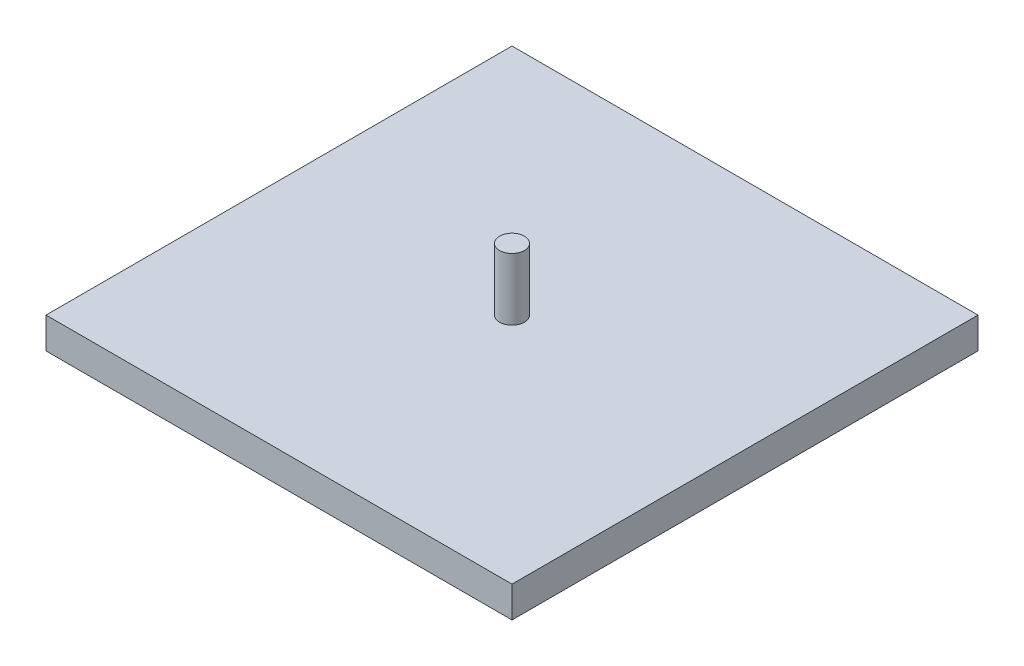
ISO-10303-21;
HEADER;
FILE_DESCRIPTION(('STEP AP214'),'2;1');
FILE_NAME('part.step','',(''),(''),'','','');
FILE_SCHEMA(('AUTOMOTIVE_DESIGN { 1 0 10303 214 1 1 1 1 }'));
ENDSEC;
DATA;
#1=APPLICATION_CONTEXT('core data for automotive mechanical design processes');
#2=APPLICATION_PROTOCOL_DEFINITION('international standard','automotive_design',2000,#1);
#3=PRODUCT_CONTEXT('',#1,'mechanical');
#4=PRODUCT('Part','Part','',(#3));
#5=PRODUCT_RELATED_PRODUCT_CATEGORY('part','',(#4));
#6=PRODUCT_DEFINITION_FORMATION('','',#4);
#7=PRODUCT_DEFINITION_CONTEXT('part definition',#1,'design');
#8=PRODUCT_DEFINITION('design','',#6,#7);
#9=PRODUCT_DEFINITION_SHAPE('','',#8);
#10=(LENGTH_UNIT() NAMED_UNIT(*) SI_UNIT(.MILLI.,.METRE.));
#11=(NAMED_UNIT(*) PLANE_ANGLE_UNIT() SI_UNIT($,.RADIAN.));
#12=(NAMED_UNIT(*) SI_UNIT($,.STERADIAN.) SOLID_ANGLE_UNIT());
#13=UNCERTAINTY_MEASURE_WITH_UNIT(LENGTH_MEASURE(1.E-05),#10,'distance_accuracy_value','');
#14=(GEOMETRIC_REPRESENTATION_CONTEXT(3) GLOBAL_UNCERTAINTY_ASSIGNED_CONTEXT((#13)) GLOBAL_UNIT_ASSIGNED_CONTEXT((#10,
#11,#12)) REPRESENTATION_CONTEXT('',''));
#15=CARTESIAN_POINT('',(0.,0.,0.));
#16=DIRECTION('',(0.,0.,1.));
#17=DIRECTION('',(1.,0.,0.));
#18=AXIS2_PLACEMENT_3D('',#15,#16,#17);
#19=CARTESIAN_POINT('',(-36.9816161073826,10.,-28.5962496644295));
#20=DIRECTION('',(1.,0.,0.));
#21=DIRECTION('',(0.,0.,-1.));
#22=AXIS2_PLACEMENT_3D('',#19,#20,#21);
#23=PLANE('',#22);
#24=DIRECTION('',(0.,0.,1.));
#25=VECTOR('',#24,1.);
#26=CARTESIAN_POINT('',(-36.9816161073826,0.,-28.5962496644295));
#27=LINE('',#26,#25);
#28=CARTESIAN_POINT('',(-36.9816161073826,0.,-28.5962496644295));
#29=VERTEX_POINT('',#28);
#30=CARTESIAN_POINT('',(-36.9816161073825,0.,121.40375033557));
#31=VERTEX_POINT('',#30);
#32=EDGE_CURVE('E96',#29,#31,#27,.T.);
#33=ORIENTED_EDGE('',*,*,#32,.T.);
#34=DIRECTION('',(0.,-1.,0.));
#35=VECTOR('',#34,1.);
#36=CARTESIAN_POINT('',(-36.9816161073825,10.,121.40375033557));
#37=LINE('',#36,#35);
#38=CARTESIAN_POINT('',(-36.9816161073825,10.,121.40375033557));
#39=VERTEX_POINT('',#38);
#40=EDGE_CURVE('E11',#39,#31,#37,.T.);
#41=ORIENTED_EDGE('',*,*,#40,.F.);
#42=DIRECTION('',(0.,0.,1.));
#43=VECTOR('',#42,1.);
#44=CARTESIAN_POINT('',(-36.9816161073826,10.,-28.5962496644295));
#45=LINE('',#44,#43);
#46=CARTESIAN_POINT('',(-36.9816161073826,10.,-28.5962496644295));
#47=VERTEX_POINT('',#46);
#48=EDGE_CURVE('E84',#47,#39,#45,.T.);
#49=ORIENTED_EDGE('',*,*,#48,.F.);
#50=DIRECTION('',(0.,-1.,0.));
#51=VECTOR('',#50,1.);
#52=CARTESIAN_POINT('',(-36.9816161073826,10.,-28.5962496644295));
#53=LINE('',#52,#51);
#54=EDGE_CURVE('E92',#47,#29,#53,.T.);
#55=ORIENTED_EDGE('',*,*,#54,.T.);
#56=EDGE_LOOP('',(#33,#41,#49,#55));
#57=FACE_BOUND('',#56,.T.);
#58=ADVANCED_FACE('F33',(#57),#23,.F.);
#59=CARTESIAN_POINT('',(-36.9816161073825,10.,121.40375033557));
#60=DIRECTION('',(0.,0.,-1.));
#61=DIRECTION('',(-1.,0.,0.));
#62=AXIS2_PLACEMENT_3D('',#59,#60,#61);
#63=PLANE('',#62);
#64=DIRECTION('',(1.,0.,0.));
#65=VECTOR('',#64,1.);
#66=CARTESIAN_POINT('',(-36.9816161073825,0.,121.40375033557));
#67=LINE('',#66,#65);
#68=CARTESIAN_POINT('',(113.018383892617,0.,121.40375033557));
#69=VERTEX_POINT('',#68);
#70=EDGE_CURVE('E88',#31,#69,#67,.T.);
#71=ORIENTED_EDGE('',*,*,#70,.T.);
#72=DIRECTION('',(0.,-1.,0.));
#73=VECTOR('',#72,1.);
#74=CARTESIAN_POINT('',(113.018383892617,10.,121.40375033557));
#75=LINE('',#74,#73);
#76=CARTESIAN_POINT('',(113.018383892617,10.,121.40375033557));
#77=VERTEX_POINT('',#76);
#78=EDGE_CURVE('E41',#77,#69,#75,.T.);
#79=ORIENTED_EDGE('',*,*,#78,.F.);
#80=DIRECTION('',(1.,0.,0.));
#81=VECTOR('',#80,1.);
#82=CARTESIAN_POINT('',(-36.9816161073825,10.,121.40375033557));
#83=LINE('',#82,#81);
#84=EDGE_CURVE('E79',#39,#77,#83,.T.);
#85=ORIENTED_EDGE('',*,*,#84,.F.);
#86=ORIENTED_EDGE('',*,*,#40,.T.);
#87=EDGE_LOOP('',(#71,#79,#85,#86));
#88=FACE_BOUND('',#87,.T.);
#89=ADVANCED_FACE('F87',(#88),#63,.F.);
#90=CARTESIAN_POINT('',(113.018383892617,10.,-28.5962496644295));
#91=DIRECTION('',(-1.,0.,0.));
#92=DIRECTION('',(0.,0.,1.));
#93=AXIS2_PLACEMENT_3D('',#90,#91,#92);
#94=PLANE('',#93);
#95=DIRECTION('',(0.,0.,-1.));
#96=VECTOR('',#95,1.);
#97=CARTESIAN_POINT('',(113.018383892617,0.,-28.5962496644295));
#98=LINE('',#97,#96);
#99=CARTESIAN_POINT('',(113.018383892617,0.,-28.5962496644295));
#100=VERTEX_POINT('',#99);
#101=EDGE_CURVE('E66',#69,#100,#98,.T.);
#102=ORIENTED_EDGE('',*,*,#101,.T.);
#103=DIRECTION('',(0.,-1.,0.));
#104=VECTOR('',#103,1.);
#105=CARTESIAN_POINT('',(113.018383892617,10.,-28.5962496644295));
#106=LINE('',#105,#104);
#107=CARTESIAN_POINT('',(113.018383892617,10.,-28.5962496644295));
#108=VERTEX_POINT('',#107);
#109=EDGE_CURVE('E89',#108,#100,#106,.T.);
#110=ORIENTED_EDGE('',*,*,#109,.F.);
#111=DIRECTION('',(0.,0.,-1.));
#112=VECTOR('',#111,1.);
#113=CARTESIAN_POINT('',(113.018383892617,10.,-28.5962496644295));
#114=LINE('',#113,#112);
#115=EDGE_CURVE('E82',#77,#108,#114,.T.);
#116=ORIENTED_EDGE('',*,*,#115,.F.);
#117=ORIENTED_EDGE('',*,*,#78,.T.);
#118=EDGE_LOOP('',(#102,#110,#116,#117));
#119=FACE_BOUND('',#118,.T.);
#120=ADVANCED_FACE('F90',(#119),#94,.F.);
#121=CARTESIAN_POINT('',(-36.9816161073826,10.,-28.5962496644295));
#122=DIRECTION('',(0.,0.,1.));
#123=DIRECTION('',(1.,0.,0.));
#124=AXIS2_PLACEMENT_3D('',#121,#122,#123);
#125=PLANE('',#124);
#126=DIRECTION('',(-1.,0.,0.));
#127=VECTOR('',#126,1.);
#128=CARTESIAN_POINT('',(-36.9816161073826,0.,-28.5962496644295));
#129=LINE('',#128,#127);
#130=EDGE_CURVE('E72',#100,#29,#129,.T.);
#131=ORIENTED_EDGE('',*,*,#130,.T.);
#132=ORIENTED_EDGE('',*,*,#54,.F.);
#133=DIRECTION('',(-1.,0.,0.));
#134=VECTOR('',#133,1.);
#135=CARTESIAN_POINT('',(-36.9816161073826,10.,-28.5962496644295));
#136=LINE('',#135,#134);
#137=EDGE_CURVE('E49',#108,#47,#136,.T.);
#138=ORIENTED_EDGE('',*,*,#137,.F.);
#139=ORIENTED_EDGE('',*,*,#109,.T.);
#140=EDGE_LOOP('',(#131,#132,#138,#139));
#141=FACE_BOUND('',#140,.T.);
#142=ADVANCED_FACE('F104',(#141),#125,.F.);
#143=CARTESIAN_POINT('',(0.,10.,0.));
#144=DIRECTION('',(0.,1.,0.));
#145=DIRECTION('',(0.,0.,1.));
#146=AXIS2_PLACEMENT_3D('',#143,#144,#145);
#147=PLANE('',#146);
#148=CARTESIAN_POINT('',(38.0183838926174,10.,46.4037503355705));
#149=DIRECTION('',(0.,1.,0.));
#150=DIRECTION('',(0.,0.,1.));
#151=AXIS2_PLACEMENT_3D('',#148,#149,#150);
#152=CIRCLE('',#151,4.00000000000001);
#153=CARTESIAN_POINT('',(38.0183838926174,10.,50.4037503355705));
#154=VERTEX_POINT('',#153);
#155=EDGE_CURVE('E110',#154,#154,#152,.T.);
#156=ORIENTED_EDGE('',*,*,#155,.F.);
#157=EDGE_LOOP('',(#156));
#158=FACE_BOUND('',#157,.T.);
#159=ORIENTED_EDGE('',*,*,#48,.T.);
#160=ORIENTED_EDGE('',*,*,#84,.T.);
#161=ORIENTED_EDGE('',*,*,#115,.T.);
#162=ORIENTED_EDGE('',*,*,#137,.T.);
#163=EDGE_LOOP('',(#159,#160,#161,#162));
#164=FACE_BOUND('',#163,.T.);
#165=ADVANCED_FACE('F80',(#158,#164),#147,.T.);
#166=CARTESIAN_POINT('',(0.,0.,0.));
#167=DIRECTION('',(0.,1.,0.));
#168=DIRECTION('',(0.,0.,1.));
#169=AXIS2_PLACEMENT_3D('',#166,#167,#168);
#170=PLANE('',#169);
#171=ORIENTED_EDGE('',*,*,#32,.F.);
#172=ORIENTED_EDGE('',*,*,#130,.F.);
#173=ORIENTED_EDGE('',*,*,#101,.F.);
#174=ORIENTED_EDGE('',*,*,#70,.F.);
#175=EDGE_LOOP('',(#171,#172,#173,#174));
#176=FACE_BOUND('',#175,.T.);
#177=ADVANCED_FACE('F107',(#176),#170,.F.);
#178=CARTESIAN_POINT('',(38.0183838926174,30.,46.4037503355705));
#179=DIRECTION('',(0.,-1.,0.));
#180=DIRECTION('',(0.,0.,-1.));
#181=AXIS2_PLACEMENT_3D('',#178,#179,#180);
#182=CYLINDRICAL_SURFACE('',#181,4.00000000000001);
#183=CARTESIAN_POINT('',(38.0183838926174,30.,46.4037503355705));
#184=DIRECTION('',(0.,1.,0.));
#185=DIRECTION('',(0.,0.,1.));
#186=AXIS2_PLACEMENT_3D('',#183,#184,#185);
#187=CIRCLE('',#186,4.00000000000001);
#188=CARTESIAN_POINT('',(38.0183838926174,30.,50.4037503355705));
#189=VERTEX_POINT('',#188);
#190=EDGE_CURVE('E99',#189,#189,#187,.T.);
#191=ORIENTED_EDGE('',*,*,#190,.F.);
#192=EDGE_LOOP('',(#191));
#193=FACE_BOUND('',#192,.T.);
#194=ORIENTED_EDGE('',*,*,#155,.T.);
#195=EDGE_LOOP('',(#194));
#196=FACE_BOUND('',#195,.T.);
#197=ADVANCED_FACE('F118',(#193,#196),#182,.T.);
#198=CARTESIAN_POINT('',(38.0183838926174,30.,46.4037503355705));
#199=DIRECTION('',(0.,1.,0.));
#200=DIRECTION('',(0.,0.,1.));
#201=AXIS2_PLACEMENT_3D('',#198,#199,#200);
#202=PLANE('',#201);
#203=ORIENTED_EDGE('',*,*,#190,.T.);
#204=EDGE_LOOP('',(#203));
#205=FACE_BOUND('',#204,.T.);
#206=ADVANCED_FACE('F116',(#205),#202,.T.);
#207=CLOSED_SHELL('',(#58,#89,#120,#142,#165,#177,#197,#206));
#208=MANIFOLD_SOLID_BREP('B2',#207);
#209=ADVANCED_BREP_SHAPE_REPRESENTATION('',(#18,#208),#14);
#210=SHAPE_DEFINITION_REPRESENTATION(#9,#209);
ENDSEC;
END-ISO-10303-21;
